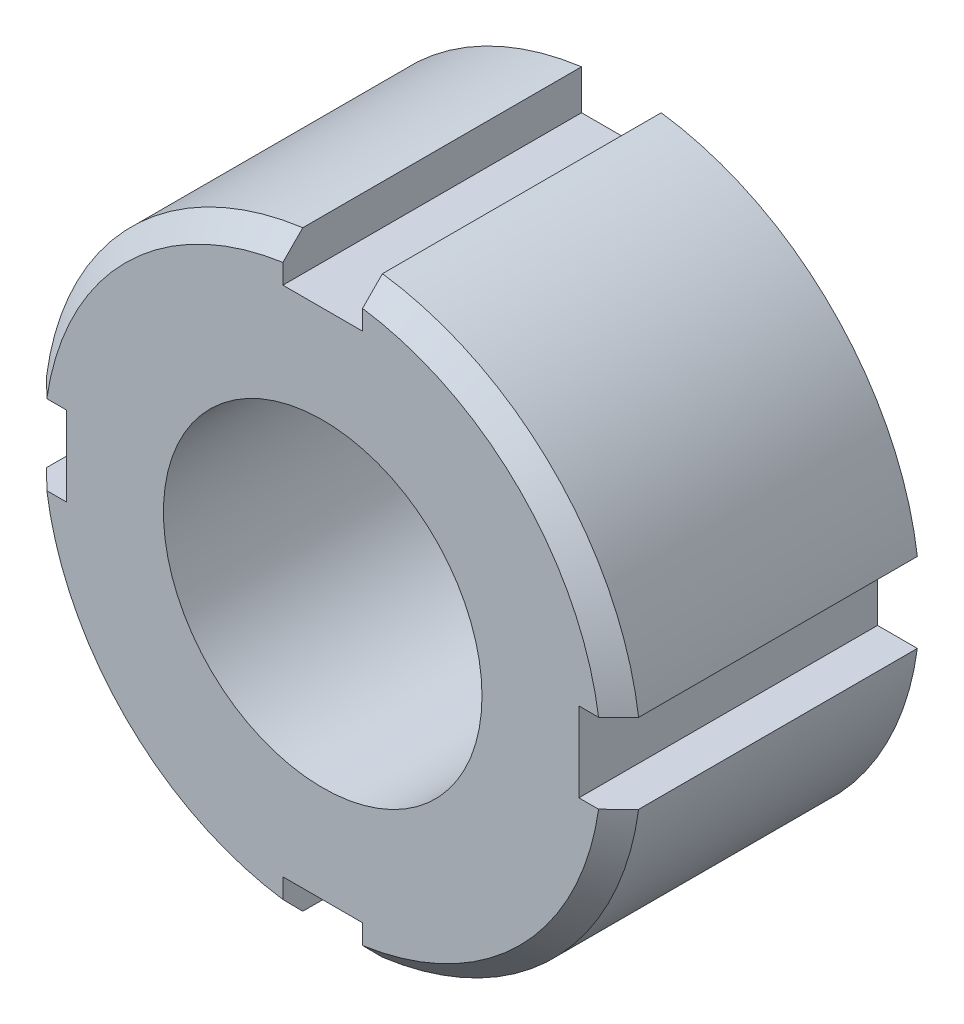
ISO-10303-21;
HEADER;
FILE_DESCRIPTION(('STEP AP214'),'2;1');
FILE_NAME('part.step','',(''),(''),'','','');
FILE_SCHEMA(('AUTOMOTIVE_DESIGN { 1 0 10303 214 1 1 1 1 }'));
ENDSEC;
DATA;
#1=APPLICATION_CONTEXT('core data for automotive mechanical design processes');
#2=APPLICATION_PROTOCOL_DEFINITION('international standard','automotive_design',2000,#1);
#3=PRODUCT_CONTEXT('',#1,'mechanical');
#4=PRODUCT('Part','Part','',(#3));
#5=PRODUCT_RELATED_PRODUCT_CATEGORY('part','',(#4));
#6=PRODUCT_DEFINITION_FORMATION('','',#4);
#7=PRODUCT_DEFINITION_CONTEXT('part definition',#1,'design');
#8=PRODUCT_DEFINITION('design','',#6,#7);
#9=PRODUCT_DEFINITION_SHAPE('','',#8);
#10=(LENGTH_UNIT() NAMED_UNIT(*) SI_UNIT(.MILLI.,.METRE.));
#11=(NAMED_UNIT(*) PLANE_ANGLE_UNIT() SI_UNIT($,.RADIAN.));
#12=(NAMED_UNIT(*) SI_UNIT($,.STERADIAN.) SOLID_ANGLE_UNIT());
#13=UNCERTAINTY_MEASURE_WITH_UNIT(LENGTH_MEASURE(1.E-05),#10,'distance_accuracy_value','');
#14=(GEOMETRIC_REPRESENTATION_CONTEXT(3) GLOBAL_UNCERTAINTY_ASSIGNED_CONTEXT((#13)) GLOBAL_UNIT_ASSIGNED_CONTEXT((#10,
#11,#12)) REPRESENTATION_CONTEXT('',''));
#15=CARTESIAN_POINT('',(0.,0.,0.));
#16=DIRECTION('',(0.,0.,1.));
#17=DIRECTION('',(1.,0.,0.));
#18=AXIS2_PLACEMENT_3D('',#15,#16,#17);
#19=CARTESIAN_POINT('',(0.,0.,15.));
#20=DIRECTION('',(0.,0.,-1.));
#21=DIRECTION('',(-1.,0.,0.));
#22=AXIS2_PLACEMENT_3D('',#19,#20,#21);
#23=CYLINDRICAL_SURFACE('',#22,15.);
#24=DIRECTION('',(0.,0.,1.));
#25=VECTOR('',#24,1.);
#26=CARTESIAN_POINT('',(-14.8660687473185,2.00000000000016,0.));
#27=LINE('',#26,#25);
#28=CARTESIAN_POINT('',(-14.8660687473185,2.00000000000016,0.));
#29=VERTEX_POINT('',#28);
#30=CARTESIAN_POINT('',(-14.8660687473185,2.00000000000016,14.));
#31=VERTEX_POINT('',#30);
#32=EDGE_CURVE('E514',#29,#31,#27,.T.);
#33=ORIENTED_EDGE('',*,*,#32,.T.);
#34=CARTESIAN_POINT('',(0.,0.,14.));
#35=DIRECTION('',(0.,0.,1.));
#36=DIRECTION('',(1.,0.,0.));
#37=AXIS2_PLACEMENT_3D('',#34,#35,#36);
#38=CIRCLE('',#37,15.);
#39=CARTESIAN_POINT('',(-2.,14.8660687473185,14.));
#40=VERTEX_POINT('',#39);
#41=EDGE_CURVE('E234',#31,#40,#38,.F.);
#42=ORIENTED_EDGE('',*,*,#41,.T.);
#43=DIRECTION('',(0.,0.,1.));
#44=VECTOR('',#43,1.);
#45=CARTESIAN_POINT('',(-2.,14.8660687473185,0.));
#46=LINE('',#45,#44);
#47=CARTESIAN_POINT('',(-2.,14.8660687473185,0.));
#48=VERTEX_POINT('',#47);
#49=EDGE_CURVE('E217',#48,#40,#46,.T.);
#50=ORIENTED_EDGE('',*,*,#49,.F.);
#51=CARTESIAN_POINT('',(0.,0.,0.));
#52=DIRECTION('',(0.,0.,1.));
#53=DIRECTION('',(1.,0.,0.));
#54=AXIS2_PLACEMENT_3D('',#51,#52,#53);
#55=CIRCLE('',#54,15.);
#56=EDGE_CURVE('E231',#48,#29,#55,.T.);
#57=ORIENTED_EDGE('',*,*,#56,.T.);
#58=EDGE_LOOP('',(#33,#42,#50,#57));
#59=FACE_BOUND('',#58,.T.);
#60=ADVANCED_FACE('F72',(#59),#23,.T.);
#61=DIRECTION('',(0.,0.,1.));
#62=VECTOR('',#61,1.);
#63=CARTESIAN_POINT('',(2.,14.8660687473185,0.));
#64=LINE('',#63,#62);
#65=CARTESIAN_POINT('',(2.,14.8660687473185,0.));
#66=VERTEX_POINT('',#65);
#67=CARTESIAN_POINT('',(2.,14.8660687473185,14.));
#68=VERTEX_POINT('',#67);
#69=EDGE_CURVE('E379',#66,#68,#64,.T.);
#70=ORIENTED_EDGE('',*,*,#69,.T.);
#71=CARTESIAN_POINT('',(0.,0.,14.));
#72=DIRECTION('',(0.,0.,1.));
#73=DIRECTION('',(1.,0.,0.));
#74=AXIS2_PLACEMENT_3D('',#71,#72,#73);
#75=CIRCLE('',#74,15.);
#76=CARTESIAN_POINT('',(14.8660687473185,1.99999999999995,14.));
#77=VERTEX_POINT('',#76);
#78=EDGE_CURVE('E87',#68,#77,#75,.F.);
#79=ORIENTED_EDGE('',*,*,#78,.T.);
#80=DIRECTION('',(0.,0.,1.));
#81=VECTOR('',#80,1.);
#82=CARTESIAN_POINT('',(14.8660687473185,1.99999999999995,0.));
#83=LINE('',#82,#81);
#84=CARTESIAN_POINT('',(14.8660687473185,1.99999999999995,0.));
#85=VERTEX_POINT('',#84);
#86=EDGE_CURVE('E421',#85,#77,#83,.T.);
#87=ORIENTED_EDGE('',*,*,#86,.F.);
#88=EDGE_CURVE('E241',#85,#66,#55,.T.);
#89=ORIENTED_EDGE('',*,*,#88,.T.);
#90=EDGE_LOOP('',(#70,#79,#87,#89));
#91=FACE_BOUND('',#90,.T.);
#92=ADVANCED_FACE('F367',(#91),#23,.T.);
#93=DIRECTION('',(0.,0.,1.));
#94=VECTOR('',#93,1.);
#95=CARTESIAN_POINT('',(14.8660687473185,-2.00000000000005,0.));
#96=LINE('',#95,#94);
#97=CARTESIAN_POINT('',(14.8660687473185,-2.00000000000005,0.));
#98=VERTEX_POINT('',#97);
#99=CARTESIAN_POINT('',(14.8660687473185,-2.00000000000005,14.));
#100=VERTEX_POINT('',#99);
#101=EDGE_CURVE('E441',#98,#100,#96,.T.);
#102=ORIENTED_EDGE('',*,*,#101,.T.);
#103=CARTESIAN_POINT('',(0.,0.,14.));
#104=DIRECTION('',(0.,0.,1.));
#105=DIRECTION('',(1.,0.,0.));
#106=AXIS2_PLACEMENT_3D('',#103,#104,#105);
#107=CIRCLE('',#106,15.);
#108=CARTESIAN_POINT('',(1.9999999999999,-14.8660687473185,14.));
#109=VERTEX_POINT('',#108);
#110=EDGE_CURVE('E285',#100,#109,#107,.F.);
#111=ORIENTED_EDGE('',*,*,#110,.T.);
#112=DIRECTION('',(0.,0.,1.));
#113=VECTOR('',#112,1.);
#114=CARTESIAN_POINT('',(1.9999999999999,-14.8660687473185,0.));
#115=LINE('',#114,#113);
#116=CARTESIAN_POINT('',(1.9999999999999,-14.8660687473185,0.));
#117=VERTEX_POINT('',#116);
#118=EDGE_CURVE('E467',#117,#109,#115,.T.);
#119=ORIENTED_EDGE('',*,*,#118,.F.);
#120=EDGE_CURVE('E252',#117,#98,#55,.T.);
#121=ORIENTED_EDGE('',*,*,#120,.T.);
#122=EDGE_LOOP('',(#102,#111,#119,#121));
#123=FACE_BOUND('',#122,.T.);
#124=ADVANCED_FACE('F364',(#123),#23,.T.);
#125=DIRECTION('',(0.,0.,1.));
#126=VECTOR('',#125,1.);
#127=CARTESIAN_POINT('',(-2.0000000000001,-14.8660687473185,0.));
#128=LINE('',#127,#126);
#129=CARTESIAN_POINT('',(-2.0000000000001,-14.8660687473185,0.));
#130=VERTEX_POINT('',#129);
#131=CARTESIAN_POINT('',(-2.0000000000001,-14.8660687473185,14.));
#132=VERTEX_POINT('',#131);
#133=EDGE_CURVE('E476',#130,#132,#128,.T.);
#134=ORIENTED_EDGE('',*,*,#133,.T.);
#135=CARTESIAN_POINT('',(0.,0.,14.));
#136=DIRECTION('',(0.,0.,1.));
#137=DIRECTION('',(1.,0.,0.));
#138=AXIS2_PLACEMENT_3D('',#135,#136,#137);
#139=CIRCLE('',#138,15.);
#140=CARTESIAN_POINT('',(-14.8660687473185,-1.99999999999984,14.));
#141=VERTEX_POINT('',#140);
#142=EDGE_CURVE('E320',#132,#141,#139,.F.);
#143=ORIENTED_EDGE('',*,*,#142,.T.);
#144=DIRECTION('',(0.,0.,1.));
#145=VECTOR('',#144,1.);
#146=CARTESIAN_POINT('',(-14.8660687473185,-1.99999999999984,0.));
#147=LINE('',#146,#145);
#148=CARTESIAN_POINT('',(-14.8660687473185,-1.99999999999984,0.));
#149=VERTEX_POINT('',#148);
#150=EDGE_CURVE('E504',#149,#141,#147,.T.);
#151=ORIENTED_EDGE('',*,*,#150,.F.);
#152=EDGE_CURVE('E243',#149,#130,#55,.T.);
#153=ORIENTED_EDGE('',*,*,#152,.T.);
#154=EDGE_LOOP('',(#134,#143,#151,#153));
#155=FACE_BOUND('',#154,.T.);
#156=ADVANCED_FACE('F358',(#155),#23,.T.);
#157=CARTESIAN_POINT('',(0.,0.,15.));
#158=DIRECTION('',(0.,0.,1.));
#159=DIRECTION('',(1.,0.,0.));
#160=AXIS2_PLACEMENT_3D('',#157,#158,#159);
#161=PLANE('',#160);
#162=CARTESIAN_POINT('',(0.,0.,15.));
#163=DIRECTION('',(0.,0.,1.));
#164=DIRECTION('',(1.,0.,0.));
#165=AXIS2_PLACEMENT_3D('',#162,#163,#164);
#166=CIRCLE('',#165,8.);
#167=CARTESIAN_POINT('',(8.,0.,15.));
#168=VERTEX_POINT('',#167);
#169=EDGE_CURVE('E756',#168,#168,#166,.T.);
#170=ORIENTED_EDGE('',*,*,#169,.F.);
#171=EDGE_LOOP('',(#170));
#172=FACE_BOUND('',#171,.T.);
#173=DIRECTION('',(0.,1.,0.));
#174=VECTOR('',#173,1.);
#175=CARTESIAN_POINT('',(1.9999999999999,-14.8660687473185,15.));
#176=LINE('',#175,#174);
#177=CARTESIAN_POINT('',(1.9999999999999,-13.856406460551,15.));
#178=VERTEX_POINT('',#177);
#179=CARTESIAN_POINT('',(1.99999999999991,-12.8660687473185,15.));
#180=VERTEX_POINT('',#179);
#181=EDGE_CURVE('E449',#178,#180,#176,.T.);
#182=ORIENTED_EDGE('',*,*,#181,.F.);
#183=CARTESIAN_POINT('',(0.,0.,15.));
#184=DIRECTION('',(0.,0.,1.));
#185=DIRECTION('',(1.,0.,0.));
#186=AXIS2_PLACEMENT_3D('',#183,#184,#185);
#187=CIRCLE('',#186,14.);
#188=CARTESIAN_POINT('',(13.856406460551,-2.00000000000005,15.));
#189=VERTEX_POINT('',#188);
#190=EDGE_CURVE('E267',#178,#189,#187,.T.);
#191=ORIENTED_EDGE('',*,*,#190,.T.);
#192=DIRECTION('',(1.,0.,0.));
#193=VECTOR('',#192,1.);
#194=CARTESIAN_POINT('',(12.8660687473185,-2.00000000000005,15.));
#195=LINE('',#194,#193);
#196=CARTESIAN_POINT('',(12.8660687473185,-2.00000000000005,15.));
#197=VERTEX_POINT('',#196);
#198=EDGE_CURVE('E446',#197,#189,#195,.T.);
#199=ORIENTED_EDGE('',*,*,#198,.F.);
#200=DIRECTION('',(0.,-1.,0.));
#201=VECTOR('',#200,1.);
#202=CARTESIAN_POINT('',(12.8660687473185,1.99999999999995,15.));
#203=LINE('',#202,#201);
#204=CARTESIAN_POINT('',(12.8660687473185,1.99999999999995,15.));
#205=VERTEX_POINT('',#204);
#206=EDGE_CURVE('E451',#205,#197,#203,.T.);
#207=ORIENTED_EDGE('',*,*,#206,.F.);
#208=DIRECTION('',(-1.,0.,0.));
#209=VECTOR('',#208,1.);
#210=CARTESIAN_POINT('',(14.8660687473185,1.99999999999995,15.));
#211=LINE('',#210,#209);
#212=CARTESIAN_POINT('',(13.856406460551,1.99999999999995,15.));
#213=VERTEX_POINT('',#212);
#214=EDGE_CURVE('E460',#213,#205,#211,.T.);
#215=ORIENTED_EDGE('',*,*,#214,.F.);
#216=CARTESIAN_POINT('',(0.,0.,15.));
#217=DIRECTION('',(0.,0.,1.));
#218=DIRECTION('',(1.,0.,0.));
#219=AXIS2_PLACEMENT_3D('',#216,#217,#218);
#220=CIRCLE('',#219,14.);
#221=CARTESIAN_POINT('',(2.,13.856406460551,15.));
#222=VERTEX_POINT('',#221);
#223=EDGE_CURVE('E253',#213,#222,#220,.T.);
#224=ORIENTED_EDGE('',*,*,#223,.T.);
#225=DIRECTION('',(0.,1.,0.));
#226=VECTOR('',#225,1.);
#227=CARTESIAN_POINT('',(2.,12.8660687473185,15.));
#228=LINE('',#227,#226);
#229=CARTESIAN_POINT('',(2.,12.8660687473185,15.));
#230=VERTEX_POINT('',#229);
#231=EDGE_CURVE('E229',#230,#222,#228,.T.);
#232=ORIENTED_EDGE('',*,*,#231,.F.);
#233=DIRECTION('',(1.,0.,0.));
#234=VECTOR('',#233,1.);
#235=CARTESIAN_POINT('',(-2.,12.8660687473185,15.));
#236=LINE('',#235,#234);
#237=CARTESIAN_POINT('',(-2.,12.8660687473185,15.));
#238=VERTEX_POINT('',#237);
#239=EDGE_CURVE('E580',#238,#230,#236,.T.);
#240=ORIENTED_EDGE('',*,*,#239,.F.);
#241=DIRECTION('',(0.,-1.,0.));
#242=VECTOR('',#241,1.);
#243=CARTESIAN_POINT('',(-2.,14.8660687473185,15.));
#244=LINE('',#243,#242);
#245=CARTESIAN_POINT('',(-2.,13.856406460551,15.));
#246=VERTEX_POINT('',#245);
#247=EDGE_CURVE('E459',#246,#238,#244,.T.);
#248=ORIENTED_EDGE('',*,*,#247,.F.);
#249=CARTESIAN_POINT('',(0.,0.,15.));
#250=DIRECTION('',(0.,0.,1.));
#251=DIRECTION('',(1.,0.,0.));
#252=AXIS2_PLACEMENT_3D('',#249,#250,#251);
#253=CIRCLE('',#252,14.);
#254=CARTESIAN_POINT('',(-13.856406460551,2.00000000000015,15.));
#255=VERTEX_POINT('',#254);
#256=EDGE_CURVE('E261',#246,#255,#253,.T.);
#257=ORIENTED_EDGE('',*,*,#256,.T.);
#258=DIRECTION('',(-1.,0.,0.));
#259=VECTOR('',#258,1.);
#260=CARTESIAN_POINT('',(-12.8660687473185,2.00000000000014,15.));
#261=LINE('',#260,#259);
#262=CARTESIAN_POINT('',(-12.8660687473185,2.00000000000014,15.));
#263=VERTEX_POINT('',#262);
#264=EDGE_CURVE('E519',#263,#255,#261,.T.);
#265=ORIENTED_EDGE('',*,*,#264,.F.);
#266=DIRECTION('',(0.,1.,0.));
#267=VECTOR('',#266,1.);
#268=CARTESIAN_POINT('',(-12.8660687473185,-1.99999999999986,15.));
#269=LINE('',#268,#267);
#270=CARTESIAN_POINT('',(-12.8660687473185,-1.99999999999986,15.));
#271=VERTEX_POINT('',#270);
#272=EDGE_CURVE('E524',#271,#263,#269,.T.);
#273=ORIENTED_EDGE('',*,*,#272,.F.);
#274=DIRECTION('',(1.,0.,0.));
#275=VECTOR('',#274,1.);
#276=CARTESIAN_POINT('',(-14.8660687473185,-1.99999999999984,15.));
#277=LINE('',#276,#275);
#278=CARTESIAN_POINT('',(-13.856406460551,-1.99999999999985,15.));
#279=VERTEX_POINT('',#278);
#280=EDGE_CURVE('E481',#279,#271,#277,.T.);
#281=ORIENTED_EDGE('',*,*,#280,.F.);
#282=CARTESIAN_POINT('',(0.,0.,15.));
#283=DIRECTION('',(0.,0.,1.));
#284=DIRECTION('',(1.,0.,0.));
#285=AXIS2_PLACEMENT_3D('',#282,#283,#284);
#286=CIRCLE('',#285,14.);
#287=CARTESIAN_POINT('',(-2.0000000000001,-13.856406460551,15.));
#288=VERTEX_POINT('',#287);
#289=EDGE_CURVE('E264',#279,#288,#286,.T.);
#290=ORIENTED_EDGE('',*,*,#289,.T.);
#291=DIRECTION('',(0.,-1.,0.));
#292=VECTOR('',#291,1.);
#293=CARTESIAN_POINT('',(-2.00000000000009,-12.8660687473185,15.));
#294=LINE('',#293,#292);
#295=CARTESIAN_POINT('',(-2.00000000000009,-12.8660687473185,15.));
#296=VERTEX_POINT('',#295);
#297=EDGE_CURVE('E485',#296,#288,#294,.T.);
#298=ORIENTED_EDGE('',*,*,#297,.F.);
#299=DIRECTION('',(-1.,0.,0.));
#300=VECTOR('',#299,1.);
#301=CARTESIAN_POINT('',(1.99999999999991,-12.8660687473185,15.));
#302=LINE('',#301,#300);
#303=EDGE_CURVE('E486',#180,#296,#302,.T.);
#304=ORIENTED_EDGE('',*,*,#303,.F.);
#305=EDGE_LOOP('',(#182,#191,#199,#207,#215,#224,#232,#240,#248,#257,#265,#273,#281,#290,#298,#304));
#306=FACE_BOUND('',#305,.T.);
#307=ADVANCED_FACE('F359',(#172,#306),#161,.T.);
#308=CARTESIAN_POINT('',(0.,0.,0.));
#309=DIRECTION('',(0.,0.,1.));
#310=DIRECTION('',(1.,0.,0.));
#311=AXIS2_PLACEMENT_3D('',#308,#309,#310);
#312=PLANE('',#311);
#313=CARTESIAN_POINT('',(0.,0.,0.));
#314=DIRECTION('',(0.,0.,1.));
#315=DIRECTION('',(1.,0.,0.));
#316=AXIS2_PLACEMENT_3D('',#313,#314,#315);
#317=CIRCLE('',#316,8.);
#318=CARTESIAN_POINT('',(8.,0.,0.));
#319=VERTEX_POINT('',#318);
#320=EDGE_CURVE('E520',#319,#319,#317,.T.);
#321=ORIENTED_EDGE('',*,*,#320,.T.);
#322=EDGE_LOOP('',(#321));
#323=FACE_BOUND('',#322,.T.);
#324=DIRECTION('',(1.,0.,0.));
#325=VECTOR('',#324,1.);
#326=CARTESIAN_POINT('',(-2.,12.8660687473185,0.));
#327=LINE('',#326,#325);
#328=CARTESIAN_POINT('',(-2.,12.8660687473185,0.));
#329=VERTEX_POINT('',#328);
#330=CARTESIAN_POINT('',(2.,12.8660687473185,0.));
#331=VERTEX_POINT('',#330);
#332=EDGE_CURVE('E230',#329,#331,#327,.T.);
#333=ORIENTED_EDGE('',*,*,#332,.T.);
#334=DIRECTION('',(0.,1.,0.));
#335=VECTOR('',#334,1.);
#336=CARTESIAN_POINT('',(2.,12.8660687473185,0.));
#337=LINE('',#336,#335);
#338=EDGE_CURVE('E240',#331,#66,#337,.T.);
#339=ORIENTED_EDGE('',*,*,#338,.T.);
#340=ORIENTED_EDGE('',*,*,#88,.F.);
#341=DIRECTION('',(-1.,0.,0.));
#342=VECTOR('',#341,1.);
#343=CARTESIAN_POINT('',(14.8660687473185,1.99999999999995,0.));
#344=LINE('',#343,#342);
#345=CARTESIAN_POINT('',(12.8660687473185,1.99999999999995,0.));
#346=VERTEX_POINT('',#345);
#347=EDGE_CURVE('E426',#85,#346,#344,.T.);
#348=ORIENTED_EDGE('',*,*,#347,.T.);
#349=DIRECTION('',(0.,-1.,0.));
#350=VECTOR('',#349,1.);
#351=CARTESIAN_POINT('',(12.8660687473185,1.99999999999995,0.));
#352=LINE('',#351,#350);
#353=CARTESIAN_POINT('',(12.8660687473185,-2.00000000000005,0.));
#354=VERTEX_POINT('',#353);
#355=EDGE_CURVE('E434',#346,#354,#352,.T.);
#356=ORIENTED_EDGE('',*,*,#355,.T.);
#357=DIRECTION('',(1.,0.,0.));
#358=VECTOR('',#357,1.);
#359=CARTESIAN_POINT('',(12.8660687473185,-2.00000000000005,0.));
#360=LINE('',#359,#358);
#361=EDGE_CURVE('E428',#354,#98,#360,.T.);
#362=ORIENTED_EDGE('',*,*,#361,.T.);
#363=ORIENTED_EDGE('',*,*,#120,.F.);
#364=DIRECTION('',(0.,1.,0.));
#365=VECTOR('',#364,1.);
#366=CARTESIAN_POINT('',(1.9999999999999,-14.8660687473185,0.));
#367=LINE('',#366,#365);
#368=CARTESIAN_POINT('',(1.99999999999991,-12.8660687473185,0.));
#369=VERTEX_POINT('',#368);
#370=EDGE_CURVE('E490',#117,#369,#367,.T.);
#371=ORIENTED_EDGE('',*,*,#370,.T.);
#372=DIRECTION('',(-1.,0.,0.));
#373=VECTOR('',#372,1.);
#374=CARTESIAN_POINT('',(1.99999999999991,-12.8660687473185,0.));
#375=LINE('',#374,#373);
#376=CARTESIAN_POINT('',(-2.00000000000009,-12.8660687473185,0.));
#377=VERTEX_POINT('',#376);
#378=EDGE_CURVE('E497',#369,#377,#375,.T.);
#379=ORIENTED_EDGE('',*,*,#378,.T.);
#380=DIRECTION('',(0.,-1.,0.));
#381=VECTOR('',#380,1.);
#382=CARTESIAN_POINT('',(-2.00000000000009,-12.8660687473185,0.));
#383=LINE('',#382,#381);
#384=EDGE_CURVE('E468',#377,#130,#383,.T.);
#385=ORIENTED_EDGE('',*,*,#384,.T.);
#386=ORIENTED_EDGE('',*,*,#152,.F.);
#387=DIRECTION('',(1.,0.,0.));
#388=VECTOR('',#387,1.);
#389=CARTESIAN_POINT('',(-14.8660687473185,-1.99999999999984,0.));
#390=LINE('',#389,#388);
#391=CARTESIAN_POINT('',(-12.8660687473185,-1.99999999999986,0.));
#392=VERTEX_POINT('',#391);
#393=EDGE_CURVE('E258',#149,#392,#390,.T.);
#394=ORIENTED_EDGE('',*,*,#393,.T.);
#395=DIRECTION('',(0.,1.,0.));
#396=VECTOR('',#395,1.);
#397=CARTESIAN_POINT('',(-12.8660687473185,-1.99999999999986,0.));
#398=LINE('',#397,#396);
#399=CARTESIAN_POINT('',(-12.8660687473185,2.00000000000014,0.));
#400=VERTEX_POINT('',#399);
#401=EDGE_CURVE('E530',#392,#400,#398,.T.);
#402=ORIENTED_EDGE('',*,*,#401,.T.);
#403=DIRECTION('',(-1.,0.,0.));
#404=VECTOR('',#403,1.);
#405=CARTESIAN_POINT('',(-12.8660687473185,2.00000000000014,0.));
#406=LINE('',#405,#404);
#407=EDGE_CURVE('E245',#400,#29,#406,.T.);
#408=ORIENTED_EDGE('',*,*,#407,.T.);
#409=ORIENTED_EDGE('',*,*,#56,.F.);
#410=DIRECTION('',(0.,-1.,0.));
#411=VECTOR('',#410,1.);
#412=CARTESIAN_POINT('',(-2.,14.8660687473185,0.));
#413=LINE('',#412,#411);
#414=EDGE_CURVE('E214',#48,#329,#413,.T.);
#415=ORIENTED_EDGE('',*,*,#414,.T.);
#416=EDGE_LOOP('',(#333,#339,#340,#348,#356,#362,#363,#371,#379,#385,#386,#394,#402,#408,#409,#415));
#417=FACE_BOUND('',#416,.T.);
#418=ADVANCED_FACE('F238',(#323,#417),#312,.F.);
#419=CARTESIAN_POINT('',(-12.8660687473185,2.00000000000014,0.));
#420=DIRECTION('',(0.,1.,0.));
#421=DIRECTION('',(-1.,0.,0.));
#422=AXIS2_PLACEMENT_3D('',#419,#420,#421);
#423=PLANE('',#422);
#424=ORIENTED_EDGE('',*,*,#264,.T.);
#425=CARTESIAN_POINT('',(-13.856406460551,2.00000000000015,15.));
#426=CARTESIAN_POINT('',(-14.0247393045906,2.00000000000015,14.8333896683725));
#427=CARTESIAN_POINT('',(-14.193044250589,2.00000000000015,14.6667511691449));
#428=CARTESIAN_POINT('',(-14.5295983461781,2.00000000000015,14.3334178358115));
#429=CARTESIAN_POINT('',(-14.6978474957689,2.00000000000015,14.1667230017058));
#430=CARTESIAN_POINT('',(-14.8660687473185,2.00000000000016,14.));
#431=B_SPLINE_CURVE_WITH_KNOTS('',3,(#425,#426,#427,#428,#429,#430),.UNSPECIFIED.,.F.,.F.,(4,2,
4),(0.,0.710531138269907,1.42106227516682),.UNSPECIFIED.);
#432=EDGE_CURVE('E343',#255,#31,#431,.T.);
#433=ORIENTED_EDGE('',*,*,#432,.T.);
#434=ORIENTED_EDGE('',*,*,#32,.F.);
#435=ORIENTED_EDGE('',*,*,#407,.F.);
#436=DIRECTION('',(0.,0.,1.));
#437=VECTOR('',#436,1.);
#438=CARTESIAN_POINT('',(-12.8660687473185,2.00000000000014,0.));
#439=LINE('',#438,#437);
#440=EDGE_CURVE('E512',#400,#263,#439,.T.);
#441=ORIENTED_EDGE('',*,*,#440,.T.);
#442=EDGE_LOOP('',(#424,#433,#434,#435,#441));
#443=FACE_BOUND('',#442,.T.);
#444=ADVANCED_FACE('F355',(#443),#423,.F.);
#445=CARTESIAN_POINT('',(-12.8660687473185,-1.99999999999986,0.));
#446=DIRECTION('',(1.,0.,0.));
#447=DIRECTION('',(0.,1.,0.));
#448=AXIS2_PLACEMENT_3D('',#445,#446,#447);
#449=PLANE('',#448);
#450=ORIENTED_EDGE('',*,*,#272,.T.);
#451=ORIENTED_EDGE('',*,*,#440,.F.);
#452=ORIENTED_EDGE('',*,*,#401,.F.);
#453=DIRECTION('',(0.,0.,1.));
#454=VECTOR('',#453,1.);
#455=CARTESIAN_POINT('',(-12.8660687473185,-1.99999999999986,0.));
#456=LINE('',#455,#454);
#457=EDGE_CURVE('E510',#392,#271,#456,.T.);
#458=ORIENTED_EDGE('',*,*,#457,.T.);
#459=EDGE_LOOP('',(#450,#451,#452,#458));
#460=FACE_BOUND('',#459,.T.);
#461=ADVANCED_FACE('F332',(#460),#449,.F.);
#462=CARTESIAN_POINT('',(-14.8660687473185,-1.99999999999984,0.));
#463=DIRECTION('',(0.,-1.,0.));
#464=DIRECTION('',(1.,0.,0.));
#465=AXIS2_PLACEMENT_3D('',#462,#463,#464);
#466=PLANE('',#465);
#467=ORIENTED_EDGE('',*,*,#150,.T.);
#468=CARTESIAN_POINT('',(-14.8660687473185,-1.99999999999984,14.));
#469=CARTESIAN_POINT('',(-14.6978474957689,-1.99999999999985,14.1667230017058));
#470=CARTESIAN_POINT('',(-14.5295983461781,-1.99999999999985,14.3334178358115));
#471=CARTESIAN_POINT('',(-14.1930442505891,-1.99999999999985,14.6667511691449));
#472=CARTESIAN_POINT('',(-14.0247393045907,-1.99999999999985,14.8333896683725));
#473=CARTESIAN_POINT('',(-13.856406460551,-1.99999999999985,15.));
#474=B_SPLINE_CURVE_WITH_KNOTS('',3,(#468,#469,#470,#471,#472,#473),.UNSPECIFIED.,.F.,.F.,(4,2,
4),(0.,0.710531136896909,1.42106227516682),.UNSPECIFIED.);
#475=EDGE_CURVE('E331',#141,#279,#474,.T.);
#476=ORIENTED_EDGE('',*,*,#475,.T.);
#477=ORIENTED_EDGE('',*,*,#280,.T.);
#478=ORIENTED_EDGE('',*,*,#457,.F.);
#479=ORIENTED_EDGE('',*,*,#393,.F.);
#480=EDGE_LOOP('',(#467,#476,#477,#478,#479));
#481=FACE_BOUND('',#480,.T.);
#482=ADVANCED_FACE('F326',(#481),#466,.F.);
#483=CARTESIAN_POINT('',(-2.00000000000009,-12.8660687473185,0.));
#484=DIRECTION('',(-1.,0.,0.));
#485=DIRECTION('',(0.,-1.,0.));
#486=AXIS2_PLACEMENT_3D('',#483,#484,#485);
#487=PLANE('',#486);
#488=ORIENTED_EDGE('',*,*,#297,.T.);
#489=CARTESIAN_POINT('',(-2.0000000000001,-13.856406460551,15.));
#490=CARTESIAN_POINT('',(-2.0000000000001,-14.0247393045906,14.8333896683725));
#491=CARTESIAN_POINT('',(-2.0000000000001,-14.193044250589,14.6667511691449));
#492=CARTESIAN_POINT('',(-2.0000000000001,-14.5295983461781,14.3334178358115));
#493=CARTESIAN_POINT('',(-2.0000000000001,-14.6978474957689,14.1667230017058));
#494=CARTESIAN_POINT('',(-2.0000000000001,-14.8660687473185,14.));
#495=B_SPLINE_CURVE_WITH_KNOTS('',3,(#489,#490,#491,#492,#493,#494),.UNSPECIFIED.,.F.,.F.,(4,2,
4),(0.,0.710531138269907,1.42106227516682),.UNSPECIFIED.);
#496=EDGE_CURVE('E309',#288,#132,#495,.T.);
#497=ORIENTED_EDGE('',*,*,#496,.T.);
#498=ORIENTED_EDGE('',*,*,#133,.F.);
#499=ORIENTED_EDGE('',*,*,#384,.F.);
#500=DIRECTION('',(0.,0.,1.));
#501=VECTOR('',#500,1.);
#502=CARTESIAN_POINT('',(-2.00000000000009,-12.8660687473185,0.));
#503=LINE('',#502,#501);
#504=EDGE_CURVE('E474',#377,#296,#503,.T.);
#505=ORIENTED_EDGE('',*,*,#504,.T.);
#506=EDGE_LOOP('',(#488,#497,#498,#499,#505));
#507=FACE_BOUND('',#506,.T.);
#508=ADVANCED_FACE('F325',(#507),#487,.F.);
#509=CARTESIAN_POINT('',(1.99999999999991,-12.8660687473185,0.));
#510=DIRECTION('',(0.,1.,0.));
#511=DIRECTION('',(-1.,0.,0.));
#512=AXIS2_PLACEMENT_3D('',#509,#510,#511);
#513=PLANE('',#512);
#514=ORIENTED_EDGE('',*,*,#303,.T.);
#515=ORIENTED_EDGE('',*,*,#504,.F.);
#516=ORIENTED_EDGE('',*,*,#378,.F.);
#517=DIRECTION('',(0.,0.,1.));
#518=VECTOR('',#517,1.);
#519=CARTESIAN_POINT('',(1.99999999999991,-12.8660687473185,0.));
#520=LINE('',#519,#518);
#521=EDGE_CURVE('E473',#369,#180,#520,.T.);
#522=ORIENTED_EDGE('',*,*,#521,.T.);
#523=EDGE_LOOP('',(#514,#515,#516,#522));
#524=FACE_BOUND('',#523,.T.);
#525=ADVANCED_FACE('F298',(#524),#513,.F.);
#526=CARTESIAN_POINT('',(1.9999999999999,-14.8660687473185,0.));
#527=DIRECTION('',(1.,0.,0.));
#528=DIRECTION('',(0.,1.,0.));
#529=AXIS2_PLACEMENT_3D('',#526,#527,#528);
#530=PLANE('',#529);
#531=ORIENTED_EDGE('',*,*,#118,.T.);
#532=CARTESIAN_POINT('',(1.9999999999999,-14.8660687473185,14.));
#533=CARTESIAN_POINT('',(1.9999999999999,-14.6978474957689,14.1667230017058));
#534=CARTESIAN_POINT('',(1.9999999999999,-14.5295983461781,14.3334178358115));
#535=CARTESIAN_POINT('',(1.9999999999999,-14.1930442505891,14.6667511691449));
#536=CARTESIAN_POINT('',(1.9999999999999,-14.0247393045907,14.8333896683725));
#537=CARTESIAN_POINT('',(1.9999999999999,-13.856406460551,15.));
#538=B_SPLINE_CURVE_WITH_KNOTS('',3,(#532,#533,#534,#535,#536,#537),.UNSPECIFIED.,.F.,.F.,(4,2,
4),(0.,0.710531136896901,1.4210622751668),.UNSPECIFIED.);
#539=EDGE_CURVE('E305',#109,#178,#538,.T.);
#540=ORIENTED_EDGE('',*,*,#539,.T.);
#541=ORIENTED_EDGE('',*,*,#181,.T.);
#542=ORIENTED_EDGE('',*,*,#521,.F.);
#543=ORIENTED_EDGE('',*,*,#370,.F.);
#544=EDGE_LOOP('',(#531,#540,#541,#542,#543));
#545=FACE_BOUND('',#544,.T.);
#546=ADVANCED_FACE('F293',(#545),#530,.F.);
#547=CARTESIAN_POINT('',(12.8660687473185,-2.00000000000005,0.));
#548=DIRECTION('',(0.,-1.,0.));
#549=DIRECTION('',(1.,0.,0.));
#550=AXIS2_PLACEMENT_3D('',#547,#548,#549);
#551=PLANE('',#550);
#552=ORIENTED_EDGE('',*,*,#198,.T.);
#553=CARTESIAN_POINT('',(13.856406460551,-2.00000000000005,15.));
#554=CARTESIAN_POINT('',(14.0247393045907,-2.00000000000005,14.8333896683725));
#555=CARTESIAN_POINT('',(14.193044250589,-2.00000000000005,14.6667511691449));
#556=CARTESIAN_POINT('',(14.5295983461781,-2.00000000000005,14.3334178358115));
#557=CARTESIAN_POINT('',(14.6978474957689,-2.00000000000005,14.1667230017058));
#558=CARTESIAN_POINT('',(14.8660687473185,-2.00000000000005,14.));
#559=B_SPLINE_CURVE_WITH_KNOTS('',3,(#553,#554,#555,#556,#557,#558),.UNSPECIFIED.,.F.,.F.,(4,2,
4),(0.,0.7105311382699,1.4210622751668),.UNSPECIFIED.);
#560=EDGE_CURVE('E272',#189,#100,#559,.T.);
#561=ORIENTED_EDGE('',*,*,#560,.T.);
#562=ORIENTED_EDGE('',*,*,#101,.F.);
#563=ORIENTED_EDGE('',*,*,#361,.F.);
#564=DIRECTION('',(0.,0.,1.));
#565=VECTOR('',#564,1.);
#566=CARTESIAN_POINT('',(12.8660687473185,-2.00000000000005,0.));
#567=LINE('',#566,#565);
#568=EDGE_CURVE('E437',#354,#197,#567,.T.);
#569=ORIENTED_EDGE('',*,*,#568,.T.);
#570=EDGE_LOOP('',(#552,#561,#562,#563,#569));
#571=FACE_BOUND('',#570,.T.);
#572=ADVANCED_FACE('F287',(#571),#551,.F.);
#573=CARTESIAN_POINT('',(12.8660687473185,1.99999999999995,0.));
#574=DIRECTION('',(-1.,0.,0.));
#575=DIRECTION('',(0.,-1.,0.));
#576=AXIS2_PLACEMENT_3D('',#573,#574,#575);
#577=PLANE('',#576);
#578=ORIENTED_EDGE('',*,*,#206,.T.);
#579=ORIENTED_EDGE('',*,*,#568,.F.);
#580=ORIENTED_EDGE('',*,*,#355,.F.);
#581=DIRECTION('',(0.,0.,1.));
#582=VECTOR('',#581,1.);
#583=CARTESIAN_POINT('',(12.8660687473185,1.99999999999995,0.));
#584=LINE('',#583,#582);
#585=EDGE_CURVE('E427',#346,#205,#584,.T.);
#586=ORIENTED_EDGE('',*,*,#585,.T.);
#587=EDGE_LOOP('',(#578,#579,#580,#586));
#588=FACE_BOUND('',#587,.T.);
#589=ADVANCED_FACE('F294',(#588),#577,.F.);
#590=CARTESIAN_POINT('',(14.8660687473185,1.99999999999995,0.));
#591=DIRECTION('',(0.,1.,0.));
#592=DIRECTION('',(-1.,0.,0.));
#593=AXIS2_PLACEMENT_3D('',#590,#591,#592);
#594=PLANE('',#593);
#595=ORIENTED_EDGE('',*,*,#86,.T.);
#596=CARTESIAN_POINT('',(14.8660687473185,1.99999999999995,14.));
#597=CARTESIAN_POINT('',(14.6978474957689,1.99999999999995,14.1667230017057));
#598=CARTESIAN_POINT('',(14.5295983461781,1.99999999999995,14.3334178358115));
#599=CARTESIAN_POINT('',(14.1930442505891,1.99999999999995,14.6667511691449));
#600=CARTESIAN_POINT('',(14.0247393045907,1.99999999999995,14.8333896683725));
#601=CARTESIAN_POINT('',(13.856406460551,1.99999999999995,15.));
#602=B_SPLINE_CURVE_WITH_KNOTS('',3,(#596,#597,#598,#599,#600,#601),.UNSPECIFIED.,.F.,.F.,(4,2,
4),(0.,0.710531136896915,1.42106227516683),.UNSPECIFIED.);
#603=EDGE_CURVE('E12',#77,#213,#602,.T.);
#604=ORIENTED_EDGE('',*,*,#603,.T.);
#605=ORIENTED_EDGE('',*,*,#214,.T.);
#606=ORIENTED_EDGE('',*,*,#585,.F.);
#607=ORIENTED_EDGE('',*,*,#347,.F.);
#608=EDGE_LOOP('',(#595,#604,#605,#606,#607));
#609=FACE_BOUND('',#608,.T.);
#610=ADVANCED_FACE('F408',(#609),#594,.F.);
#611=CARTESIAN_POINT('',(2.,12.8660687473185,0.));
#612=DIRECTION('',(1.,0.,0.));
#613=DIRECTION('',(0.,0.,-1.));
#614=AXIS2_PLACEMENT_3D('',#611,#612,#613);
#615=PLANE('',#614);
#616=ORIENTED_EDGE('',*,*,#231,.T.);
#617=CARTESIAN_POINT('',(2.,13.856406460551,15.));
#618=CARTESIAN_POINT('',(2.,14.0247393045907,14.8333896683725));
#619=CARTESIAN_POINT('',(2.,14.193044250589,14.6667511691449));
#620=CARTESIAN_POINT('',(2.,14.5295983461781,14.3334178358115));
#621=CARTESIAN_POINT('',(2.,14.6978474957689,14.1667230017057));
#622=CARTESIAN_POINT('',(2.,14.8660687473185,14.));
#623=B_SPLINE_CURVE_WITH_KNOTS('',3,(#617,#618,#619,#620,#621,#622),.UNSPECIFIED.,.F.,.F.,(4,2,
4),(0.,0.710531138269912,1.42106227516683),.UNSPECIFIED.);
#624=EDGE_CURVE('E101',#222,#68,#623,.T.);
#625=ORIENTED_EDGE('',*,*,#624,.T.);
#626=ORIENTED_EDGE('',*,*,#69,.F.);
#627=ORIENTED_EDGE('',*,*,#338,.F.);
#628=DIRECTION('',(0.,0.,1.));
#629=VECTOR('',#628,1.);
#630=CARTESIAN_POINT('',(2.,12.8660687473185,0.));
#631=LINE('',#630,#629);
#632=EDGE_CURVE('E383',#331,#230,#631,.T.);
#633=ORIENTED_EDGE('',*,*,#632,.T.);
#634=EDGE_LOOP('',(#616,#625,#626,#627,#633));
#635=FACE_BOUND('',#634,.T.);
#636=ADVANCED_FACE('F404',(#635),#615,.F.);
#637=CARTESIAN_POINT('',(-2.,12.8660687473185,0.));
#638=DIRECTION('',(0.,-1.,0.));
#639=DIRECTION('',(0.,0.,-1.));
#640=AXIS2_PLACEMENT_3D('',#637,#638,#639);
#641=PLANE('',#640);
#642=ORIENTED_EDGE('',*,*,#239,.T.);
#643=ORIENTED_EDGE('',*,*,#632,.F.);
#644=ORIENTED_EDGE('',*,*,#332,.F.);
#645=DIRECTION('',(0.,0.,1.));
#646=VECTOR('',#645,1.);
#647=CARTESIAN_POINT('',(-2.,12.8660687473185,0.));
#648=LINE('',#647,#646);
#649=EDGE_CURVE('E222',#329,#238,#648,.T.);
#650=ORIENTED_EDGE('',*,*,#649,.T.);
#651=EDGE_LOOP('',(#642,#643,#644,#650));
#652=FACE_BOUND('',#651,.T.);
#653=ADVANCED_FACE('F406',(#652),#641,.F.);
#654=CARTESIAN_POINT('',(-2.,14.8660687473185,0.));
#655=DIRECTION('',(-1.,0.,0.));
#656=DIRECTION('',(0.,0.,1.));
#657=AXIS2_PLACEMENT_3D('',#654,#655,#656);
#658=PLANE('',#657);
#659=ORIENTED_EDGE('',*,*,#49,.T.);
#660=CARTESIAN_POINT('',(-2.,14.8660687473185,14.));
#661=CARTESIAN_POINT('',(-2.,14.6978474957689,14.1667230017058));
#662=CARTESIAN_POINT('',(-2.,14.5295983461781,14.3334178358115));
#663=CARTESIAN_POINT('',(-2.,14.193044250589,14.6667511691449));
#664=CARTESIAN_POINT('',(-2.,14.0247393045907,14.8333896683725));
#665=CARTESIAN_POINT('',(-2.,13.856406460551,15.));
#666=B_SPLINE_CURVE_WITH_KNOTS('',3,(#660,#661,#662,#663,#664,#665),.UNSPECIFIED.,.F.,.F.,(4,2,
4),(0.,0.710531136896909,1.42106227516682),.UNSPECIFIED.);
#667=EDGE_CURVE('E395',#40,#246,#666,.T.);
#668=ORIENTED_EDGE('',*,*,#667,.T.);
#669=ORIENTED_EDGE('',*,*,#247,.T.);
#670=ORIENTED_EDGE('',*,*,#649,.F.);
#671=ORIENTED_EDGE('',*,*,#414,.F.);
#672=EDGE_LOOP('',(#659,#668,#669,#670,#671));
#673=FACE_BOUND('',#672,.T.);
#674=ADVANCED_FACE('F220',(#673),#658,.F.);
#675=CARTESIAN_POINT('',(0.,0.,0.));
#676=DIRECTION('',(0.,0.,1.));
#677=DIRECTION('',(1.,0.,0.));
#678=AXIS2_PLACEMENT_3D('',#675,#676,#677);
#679=CYLINDRICAL_SURFACE('',#678,8.);
#680=ORIENTED_EDGE('',*,*,#320,.F.);
#681=EDGE_LOOP('',(#680));
#682=FACE_BOUND('',#681,.T.);
#683=ORIENTED_EDGE('',*,*,#169,.T.);
#684=EDGE_LOOP('',(#683));
#685=FACE_BOUND('',#684,.T.);
#686=ADVANCED_FACE('F412',(#682,#685),#679,.F.);
#687=CARTESIAN_POINT('',(0.,0.,15.));
#688=DIRECTION('',(0.,0.,-1.));
#689=DIRECTION('',(-1.,0.,0.));
#690=AXIS2_PLACEMENT_3D('',#687,#688,#689);
#691=CONICAL_SURFACE('',#690,14.,0.785398163397447);
#692=ORIENTED_EDGE('',*,*,#539,.F.);
#693=ORIENTED_EDGE('',*,*,#110,.F.);
#694=ORIENTED_EDGE('',*,*,#560,.F.);
#695=ORIENTED_EDGE('',*,*,#190,.F.);
#696=EDGE_LOOP('',(#692,#693,#694,#695));
#697=FACE_BOUND('',#696,.T.);
#698=ADVANCED_FACE('F283',(#697),#691,.T.);
#699=CARTESIAN_POINT('',(0.,0.,15.));
#700=DIRECTION('',(0.,0.,-1.));
#701=DIRECTION('',(-1.,0.,0.));
#702=AXIS2_PLACEMENT_3D('',#699,#700,#701);
#703=CONICAL_SURFACE('',#702,14.,0.78539816339745);
#704=ORIENTED_EDGE('',*,*,#475,.F.);
#705=ORIENTED_EDGE('',*,*,#142,.F.);
#706=ORIENTED_EDGE('',*,*,#496,.F.);
#707=ORIENTED_EDGE('',*,*,#289,.F.);
#708=EDGE_LOOP('',(#704,#705,#706,#707));
#709=FACE_BOUND('',#708,.T.);
#710=ADVANCED_FACE('F319',(#709),#703,.T.);
#711=CARTESIAN_POINT('',(0.,0.,15.));
#712=DIRECTION('',(0.,0.,-1.));
#713=DIRECTION('',(-1.,0.,0.));
#714=AXIS2_PLACEMENT_3D('',#711,#712,#713);
#715=CONICAL_SURFACE('',#714,14.,0.785398163397449);
#716=ORIENTED_EDGE('',*,*,#667,.F.);
#717=ORIENTED_EDGE('',*,*,#41,.F.);
#718=ORIENTED_EDGE('',*,*,#432,.F.);
#719=ORIENTED_EDGE('',*,*,#256,.F.);
#720=EDGE_LOOP('',(#716,#717,#718,#719));
#721=FACE_BOUND('',#720,.T.);
#722=ADVANCED_FACE('F348',(#721),#715,.T.);
#723=CARTESIAN_POINT('',(0.,0.,15.));
#724=DIRECTION('',(0.,0.,-1.));
#725=DIRECTION('',(-1.,0.,0.));
#726=AXIS2_PLACEMENT_3D('',#723,#724,#725);
#727=CONICAL_SURFACE('',#726,14.,0.785398163397443);
#728=ORIENTED_EDGE('',*,*,#603,.F.);
#729=ORIENTED_EDGE('',*,*,#78,.F.);
#730=ORIENTED_EDGE('',*,*,#624,.F.);
#731=ORIENTED_EDGE('',*,*,#223,.F.);
#732=EDGE_LOOP('',(#728,#729,#730,#731));
#733=FACE_BOUND('',#732,.T.);
#734=ADVANCED_FACE('F74',(#733),#727,.T.);
#735=CLOSED_SHELL('',(#60,#92,#124,#156,#307,#418,#444,#461,#482,#508,#525,#546,#572,#589,#610,
#636,#653,#674,#686,#698,#710,#722,#734));
#736=MANIFOLD_SOLID_BREP('B2',#735);
#737=ADVANCED_BREP_SHAPE_REPRESENTATION('',(#18,#736),#14);
#738=SHAPE_DEFINITION_REPRESENTATION(#9,#737);
ENDSEC;
END-ISO-10303-21;
